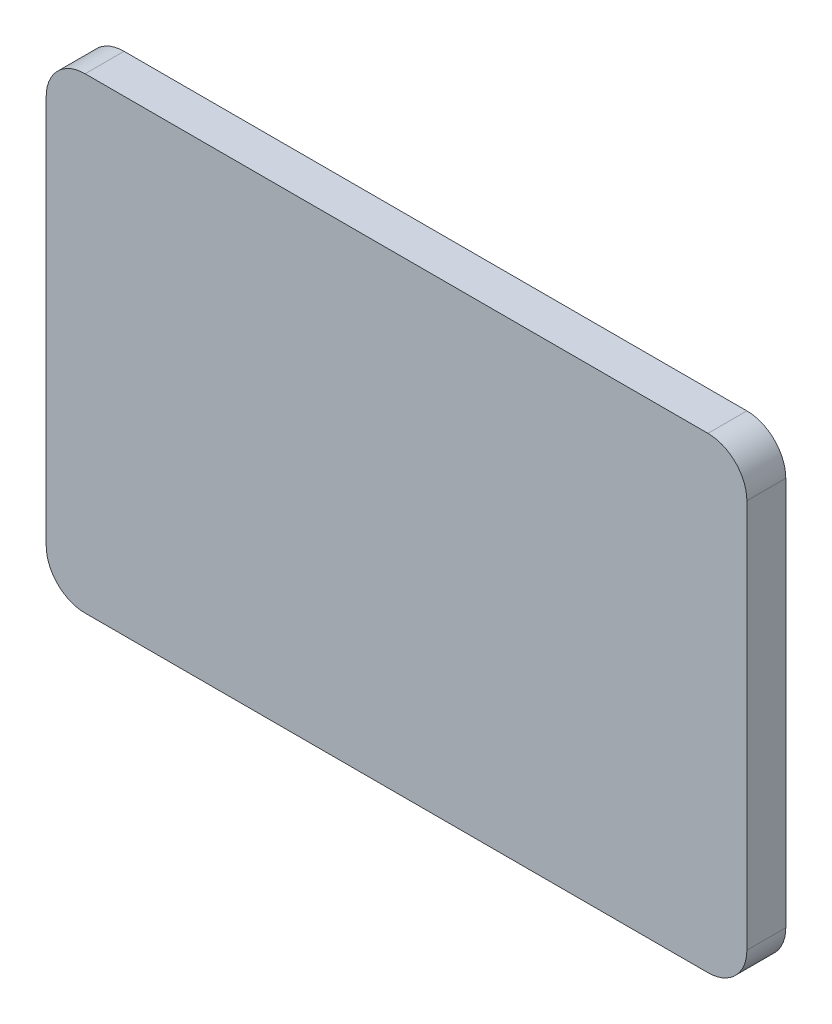
ISO-10303-21;
HEADER;
FILE_DESCRIPTION(('STEP AP214'),'2;1');
FILE_NAME('part.step','',(''),(''),'','','');
FILE_SCHEMA(('AUTOMOTIVE_DESIGN { 1 0 10303 214 1 1 1 1 }'));
ENDSEC;
DATA;
#1=APPLICATION_CONTEXT('core data for automotive mechanical design processes');
#2=APPLICATION_PROTOCOL_DEFINITION('international standard','automotive_design',2000,#1);
#3=PRODUCT_CONTEXT('',#1,'mechanical');
#4=PRODUCT('Part','Part','',(#3));
#5=PRODUCT_RELATED_PRODUCT_CATEGORY('part','',(#4));
#6=PRODUCT_DEFINITION_FORMATION('','',#4);
#7=PRODUCT_DEFINITION_CONTEXT('part definition',#1,'design');
#8=PRODUCT_DEFINITION('design','',#6,#7);
#9=PRODUCT_DEFINITION_SHAPE('','',#8);
#10=(LENGTH_UNIT() NAMED_UNIT(*) SI_UNIT(.MILLI.,.METRE.));
#11=(NAMED_UNIT(*) PLANE_ANGLE_UNIT() SI_UNIT($,.RADIAN.));
#12=(NAMED_UNIT(*) SI_UNIT($,.STERADIAN.) SOLID_ANGLE_UNIT());
#13=UNCERTAINTY_MEASURE_WITH_UNIT(LENGTH_MEASURE(1.E-05),#10,'distance_accuracy_value','');
#14=(GEOMETRIC_REPRESENTATION_CONTEXT(3) GLOBAL_UNCERTAINTY_ASSIGNED_CONTEXT((#13)) GLOBAL_UNIT_ASSIGNED_CONTEXT((#10,
#11,#12)) REPRESENTATION_CONTEXT('',''));
#15=CARTESIAN_POINT('',(0.,0.,0.));
#16=DIRECTION('',(0.,0.,1.));
#17=DIRECTION('',(1.,0.,0.));
#18=AXIS2_PLACEMENT_3D('',#15,#16,#17);
#19=CARTESIAN_POINT('',(-80.,50.,10.));
#20=DIRECTION('',(0.,0.,-1.));
#21=DIRECTION('',(-1.,0.,0.));
#22=AXIS2_PLACEMENT_3D('',#19,#20,#21);
#23=CYLINDRICAL_SURFACE('',#22,9.99999999999999);
#24=CARTESIAN_POINT('',(-80.,50.,0.));
#25=DIRECTION('',(0.,0.,1.));
#26=DIRECTION('',(1.,0.,0.));
#27=AXIS2_PLACEMENT_3D('',#24,#25,#26);
#28=CIRCLE('',#27,9.99999999999999);
#29=CARTESIAN_POINT('',(-80.,60.,0.));
#30=VERTEX_POINT('',#29);
#31=CARTESIAN_POINT('',(-90.,50.,0.));
#32=VERTEX_POINT('',#31);
#33=EDGE_CURVE('E127',#30,#32,#28,.T.);
#34=ORIENTED_EDGE('',*,*,#33,.T.);
#35=DIRECTION('',(0.,0.,-1.));
#36=VECTOR('',#35,1.);
#37=CARTESIAN_POINT('',(-90.,50.,10.));
#38=LINE('',#37,#36);
#39=CARTESIAN_POINT('',(-90.,50.,10.));
#40=VERTEX_POINT('',#39);
#41=EDGE_CURVE('E11',#40,#32,#38,.T.);
#42=ORIENTED_EDGE('',*,*,#41,.F.);
#43=CARTESIAN_POINT('',(-80.,50.,10.));
#44=DIRECTION('',(0.,0.,1.));
#45=DIRECTION('',(1.,0.,0.));
#46=AXIS2_PLACEMENT_3D('',#43,#44,#45);
#47=CIRCLE('',#46,9.99999999999999);
#48=CARTESIAN_POINT('',(-80.,60.,10.));
#49=VERTEX_POINT('',#48);
#50=EDGE_CURVE('E141',#49,#40,#47,.T.);
#51=ORIENTED_EDGE('',*,*,#50,.F.);
#52=DIRECTION('',(0.,0.,-1.));
#53=VECTOR('',#52,1.);
#54=CARTESIAN_POINT('',(-80.,60.,10.));
#55=LINE('',#54,#53);
#56=EDGE_CURVE('E123',#49,#30,#55,.T.);
#57=ORIENTED_EDGE('',*,*,#56,.T.);
#58=EDGE_LOOP('',(#34,#42,#51,#57));
#59=FACE_BOUND('',#58,.T.);
#60=ADVANCED_FACE('F31',(#59),#23,.T.);
#61=CARTESIAN_POINT('',(-90.,-50.,10.));
#62=DIRECTION('',(1.,0.,0.));
#63=DIRECTION('',(0.,1.,0.));
#64=AXIS2_PLACEMENT_3D('',#61,#62,#63);
#65=PLANE('',#64);
#66=DIRECTION('',(0.,-1.,0.));
#67=VECTOR('',#66,1.);
#68=CARTESIAN_POINT('',(-90.,-50.,0.));
#69=LINE('',#68,#67);
#70=CARTESIAN_POINT('',(-90.,-50.,0.));
#71=VERTEX_POINT('',#70);
#72=EDGE_CURVE('E130',#32,#71,#69,.T.);
#73=ORIENTED_EDGE('',*,*,#72,.T.);
#74=DIRECTION('',(0.,0.,-1.));
#75=VECTOR('',#74,1.);
#76=CARTESIAN_POINT('',(-90.,-50.,10.));
#77=LINE('',#76,#75);
#78=CARTESIAN_POINT('',(-90.,-50.,10.));
#79=VERTEX_POINT('',#78);
#80=EDGE_CURVE('E39',#79,#71,#77,.T.);
#81=ORIENTED_EDGE('',*,*,#80,.F.);
#82=DIRECTION('',(0.,-1.,0.));
#83=VECTOR('',#82,1.);
#84=CARTESIAN_POINT('',(-90.,-50.,10.));
#85=LINE('',#84,#83);
#86=EDGE_CURVE('E90',#40,#79,#85,.T.);
#87=ORIENTED_EDGE('',*,*,#86,.F.);
#88=ORIENTED_EDGE('',*,*,#41,.T.);
#89=EDGE_LOOP('',(#73,#81,#87,#88));
#90=FACE_BOUND('',#89,.T.);
#91=ADVANCED_FACE('F176',(#90),#65,.F.);
#92=CARTESIAN_POINT('',(-80.,-50.,10.));
#93=DIRECTION('',(0.,0.,-1.));
#94=DIRECTION('',(-1.,0.,0.));
#95=AXIS2_PLACEMENT_3D('',#92,#93,#94);
#96=CYLINDRICAL_SURFACE('',#95,10.);
#97=CARTESIAN_POINT('',(-80.,-50.,0.));
#98=DIRECTION('',(0.,0.,1.));
#99=DIRECTION('',(-1.,0.,0.));
#100=AXIS2_PLACEMENT_3D('',#97,#98,#99);
#101=CIRCLE('',#100,10.);
#102=CARTESIAN_POINT('',(-80.,-60.,0.));
#103=VERTEX_POINT('',#102);
#104=EDGE_CURVE('E132',#71,#103,#101,.T.);
#105=ORIENTED_EDGE('',*,*,#104,.T.);
#106=DIRECTION('',(0.,0.,-1.));
#107=VECTOR('',#106,1.);
#108=CARTESIAN_POINT('',(-80.,-60.,10.));
#109=LINE('',#108,#107);
#110=CARTESIAN_POINT('',(-80.,-60.,10.));
#111=VERTEX_POINT('',#110);
#112=EDGE_CURVE('E148',#111,#103,#109,.T.);
#113=ORIENTED_EDGE('',*,*,#112,.F.);
#114=CARTESIAN_POINT('',(-80.,-50.,10.));
#115=DIRECTION('',(0.,0.,1.));
#116=DIRECTION('',(-1.,0.,0.));
#117=AXIS2_PLACEMENT_3D('',#114,#115,#116);
#118=CIRCLE('',#117,10.);
#119=EDGE_CURVE('E156',#79,#111,#118,.T.);
#120=ORIENTED_EDGE('',*,*,#119,.F.);
#121=ORIENTED_EDGE('',*,*,#80,.T.);
#122=EDGE_LOOP('',(#105,#113,#120,#121));
#123=FACE_BOUND('',#122,.T.);
#124=ADVANCED_FACE('F154',(#123),#96,.T.);
#125=CARTESIAN_POINT('',(80.,-60.,10.));
#126=DIRECTION('',(0.,1.,0.));
#127=DIRECTION('',(-1.,0.,0.));
#128=AXIS2_PLACEMENT_3D('',#125,#126,#127);
#129=PLANE('',#128);
#130=DIRECTION('',(1.,0.,0.));
#131=VECTOR('',#130,1.);
#132=CARTESIAN_POINT('',(80.,-60.,0.));
#133=LINE('',#132,#131);
#134=CARTESIAN_POINT('',(80.,-60.,0.));
#135=VERTEX_POINT('',#134);
#136=EDGE_CURVE('E134',#103,#135,#133,.T.);
#137=ORIENTED_EDGE('',*,*,#136,.T.);
#138=DIRECTION('',(0.,0.,-1.));
#139=VECTOR('',#138,1.);
#140=CARTESIAN_POINT('',(80.,-60.,10.));
#141=LINE('',#140,#139);
#142=CARTESIAN_POINT('',(80.,-60.,10.));
#143=VERTEX_POINT('',#142);
#144=EDGE_CURVE('E145',#143,#135,#141,.T.);
#145=ORIENTED_EDGE('',*,*,#144,.F.);
#146=DIRECTION('',(1.,0.,0.));
#147=VECTOR('',#146,1.);
#148=CARTESIAN_POINT('',(80.,-60.,10.));
#149=LINE('',#148,#147);
#150=EDGE_CURVE('E168',#111,#143,#149,.T.);
#151=ORIENTED_EDGE('',*,*,#150,.F.);
#152=ORIENTED_EDGE('',*,*,#112,.T.);
#153=EDGE_LOOP('',(#137,#145,#151,#152));
#154=FACE_BOUND('',#153,.T.);
#155=ADVANCED_FACE('F164',(#154),#129,.F.);
#156=CARTESIAN_POINT('',(80.,-50.,10.));
#157=DIRECTION('',(0.,0.,-1.));
#158=DIRECTION('',(-1.,0.,0.));
#159=AXIS2_PLACEMENT_3D('',#156,#157,#158);
#160=CYLINDRICAL_SURFACE('',#159,10.);
#161=CARTESIAN_POINT('',(80.,-50.,0.));
#162=DIRECTION('',(0.,0.,1.));
#163=DIRECTION('',(-1.,0.,0.));
#164=AXIS2_PLACEMENT_3D('',#161,#162,#163);
#165=CIRCLE('',#164,10.);
#166=CARTESIAN_POINT('',(90.,-50.,0.));
#167=VERTEX_POINT('',#166);
#168=EDGE_CURVE('E136',#135,#167,#165,.T.);
#169=ORIENTED_EDGE('',*,*,#168,.T.);
#170=DIRECTION('',(0.,0.,-1.));
#171=VECTOR('',#170,1.);
#172=CARTESIAN_POINT('',(90.,-50.,10.));
#173=LINE('',#172,#171);
#174=CARTESIAN_POINT('',(90.,-50.,10.));
#175=VERTEX_POINT('',#174);
#176=EDGE_CURVE('E118',#175,#167,#173,.T.);
#177=ORIENTED_EDGE('',*,*,#176,.F.);
#178=CARTESIAN_POINT('',(80.,-50.,10.));
#179=DIRECTION('',(0.,0.,1.));
#180=DIRECTION('',(-1.,0.,0.));
#181=AXIS2_PLACEMENT_3D('',#178,#179,#180);
#182=CIRCLE('',#181,10.);
#183=EDGE_CURVE('E109',#143,#175,#182,.T.);
#184=ORIENTED_EDGE('',*,*,#183,.F.);
#185=ORIENTED_EDGE('',*,*,#144,.T.);
#186=EDGE_LOOP('',(#169,#177,#184,#185));
#187=FACE_BOUND('',#186,.T.);
#188=ADVANCED_FACE('F167',(#187),#160,.T.);
#189=CARTESIAN_POINT('',(90.,-50.,10.));
#190=DIRECTION('',(-1.,0.,0.));
#191=DIRECTION('',(0.,-1.,0.));
#192=AXIS2_PLACEMENT_3D('',#189,#190,#191);
#193=PLANE('',#192);
#194=DIRECTION('',(0.,1.,0.));
#195=VECTOR('',#194,1.);
#196=CARTESIAN_POINT('',(90.,-50.,0.));
#197=LINE('',#196,#195);
#198=CARTESIAN_POINT('',(90.,50.,0.));
#199=VERTEX_POINT('',#198);
#200=EDGE_CURVE('E117',#167,#199,#197,.T.);
#201=ORIENTED_EDGE('',*,*,#200,.T.);
#202=DIRECTION('',(0.,0.,-1.));
#203=VECTOR('',#202,1.);
#204=CARTESIAN_POINT('',(90.,50.,10.));
#205=LINE('',#204,#203);
#206=CARTESIAN_POINT('',(90.,50.,10.));
#207=VERTEX_POINT('',#206);
#208=EDGE_CURVE('E114',#207,#199,#205,.T.);
#209=ORIENTED_EDGE('',*,*,#208,.F.);
#210=DIRECTION('',(0.,1.,0.));
#211=VECTOR('',#210,1.);
#212=CARTESIAN_POINT('',(90.,-50.,10.));
#213=LINE('',#212,#211);
#214=EDGE_CURVE('E103',#175,#207,#213,.T.);
#215=ORIENTED_EDGE('',*,*,#214,.F.);
#216=ORIENTED_EDGE('',*,*,#176,.T.);
#217=EDGE_LOOP('',(#201,#209,#215,#216));
#218=FACE_BOUND('',#217,.T.);
#219=ADVANCED_FACE('F115',(#218),#193,.F.);
#220=CARTESIAN_POINT('',(80.,50.,10.));
#221=DIRECTION('',(0.,0.,-1.));
#222=DIRECTION('',(-1.,0.,0.));
#223=AXIS2_PLACEMENT_3D('',#220,#221,#222);
#224=CYLINDRICAL_SURFACE('',#223,10.);
#225=CARTESIAN_POINT('',(80.,50.,0.));
#226=DIRECTION('',(0.,0.,1.));
#227=DIRECTION('',(1.,0.,0.));
#228=AXIS2_PLACEMENT_3D('',#225,#226,#227);
#229=CIRCLE('',#228,10.);
#230=CARTESIAN_POINT('',(80.,60.,0.));
#231=VERTEX_POINT('',#230);
#232=EDGE_CURVE('E76',#199,#231,#229,.T.);
#233=ORIENTED_EDGE('',*,*,#232,.T.);
#234=DIRECTION('',(0.,0.,-1.));
#235=VECTOR('',#234,1.);
#236=CARTESIAN_POINT('',(80.,60.,10.));
#237=LINE('',#236,#235);
#238=CARTESIAN_POINT('',(80.,60.,10.));
#239=VERTEX_POINT('',#238);
#240=EDGE_CURVE('E119',#239,#231,#237,.T.);
#241=ORIENTED_EDGE('',*,*,#240,.F.);
#242=CARTESIAN_POINT('',(80.,50.,10.));
#243=DIRECTION('',(0.,0.,1.));
#244=DIRECTION('',(1.,0.,0.));
#245=AXIS2_PLACEMENT_3D('',#242,#243,#244);
#246=CIRCLE('',#245,10.);
#247=EDGE_CURVE('E107',#207,#239,#246,.T.);
#248=ORIENTED_EDGE('',*,*,#247,.F.);
#249=ORIENTED_EDGE('',*,*,#208,.T.);
#250=EDGE_LOOP('',(#233,#241,#248,#249));
#251=FACE_BOUND('',#250,.T.);
#252=ADVANCED_FACE('F121',(#251),#224,.T.);
#253=CARTESIAN_POINT('',(80.,60.,10.));
#254=DIRECTION('',(0.,-1.,0.));
#255=DIRECTION('',(1.,0.,0.));
#256=AXIS2_PLACEMENT_3D('',#253,#254,#255);
#257=PLANE('',#256);
#258=DIRECTION('',(-1.,0.,0.));
#259=VECTOR('',#258,1.);
#260=CARTESIAN_POINT('',(80.,60.,0.));
#261=LINE('',#260,#259);
#262=EDGE_CURVE('E82',#231,#30,#261,.T.);
#263=ORIENTED_EDGE('',*,*,#262,.T.);
#264=ORIENTED_EDGE('',*,*,#56,.F.);
#265=DIRECTION('',(-1.,0.,0.));
#266=VECTOR('',#265,1.);
#267=CARTESIAN_POINT('',(80.,60.,10.));
#268=LINE('',#267,#266);
#269=EDGE_CURVE('E47',#239,#49,#268,.T.);
#270=ORIENTED_EDGE('',*,*,#269,.F.);
#271=ORIENTED_EDGE('',*,*,#240,.T.);
#272=EDGE_LOOP('',(#263,#264,#270,#271));
#273=FACE_BOUND('',#272,.T.);
#274=ADVANCED_FACE('F192',(#273),#257,.F.);
#275=CARTESIAN_POINT('',(-80.,50.,10.));
#276=DIRECTION('',(0.,0.,1.));
#277=DIRECTION('',(1.,0.,0.));
#278=AXIS2_PLACEMENT_3D('',#275,#276,#277);
#279=PLANE('',#278);
#280=ORIENTED_EDGE('',*,*,#50,.T.);
#281=ORIENTED_EDGE('',*,*,#86,.T.);
#282=ORIENTED_EDGE('',*,*,#119,.T.);
#283=ORIENTED_EDGE('',*,*,#150,.T.);
#284=ORIENTED_EDGE('',*,*,#183,.T.);
#285=ORIENTED_EDGE('',*,*,#214,.T.);
#286=ORIENTED_EDGE('',*,*,#247,.T.);
#287=ORIENTED_EDGE('',*,*,#269,.T.);
#288=EDGE_LOOP('',(#280,#281,#282,#283,#284,#285,#286,#287));
#289=FACE_BOUND('',#288,.T.);
#290=ADVANCED_FACE('F105',(#289),#279,.T.);
#291=CARTESIAN_POINT('',(-80.,50.,0.));
#292=DIRECTION('',(0.,0.,1.));
#293=DIRECTION('',(1.,0.,0.));
#294=AXIS2_PLACEMENT_3D('',#291,#292,#293);
#295=PLANE('',#294);
#296=ORIENTED_EDGE('',*,*,#33,.F.);
#297=ORIENTED_EDGE('',*,*,#262,.F.);
#298=ORIENTED_EDGE('',*,*,#232,.F.);
#299=ORIENTED_EDGE('',*,*,#200,.F.);
#300=ORIENTED_EDGE('',*,*,#168,.F.);
#301=ORIENTED_EDGE('',*,*,#136,.F.);
#302=ORIENTED_EDGE('',*,*,#104,.F.);
#303=ORIENTED_EDGE('',*,*,#72,.F.);
#304=EDGE_LOOP('',(#296,#297,#298,#299,#300,#301,#302,#303));
#305=FACE_BOUND('',#304,.T.);
#306=ADVANCED_FACE('F160',(#305),#295,.F.);
#307=CLOSED_SHELL('',(#60,#91,#124,#155,#188,#219,#252,#274,#290,#306));
#308=MANIFOLD_SOLID_BREP('B2',#307);
#309=ADVANCED_BREP_SHAPE_REPRESENTATION('',(#18,#308),#14);
#310=SHAPE_DEFINITION_REPRESENTATION(#9,#309);
ENDSEC;
END-ISO-10303-21;
